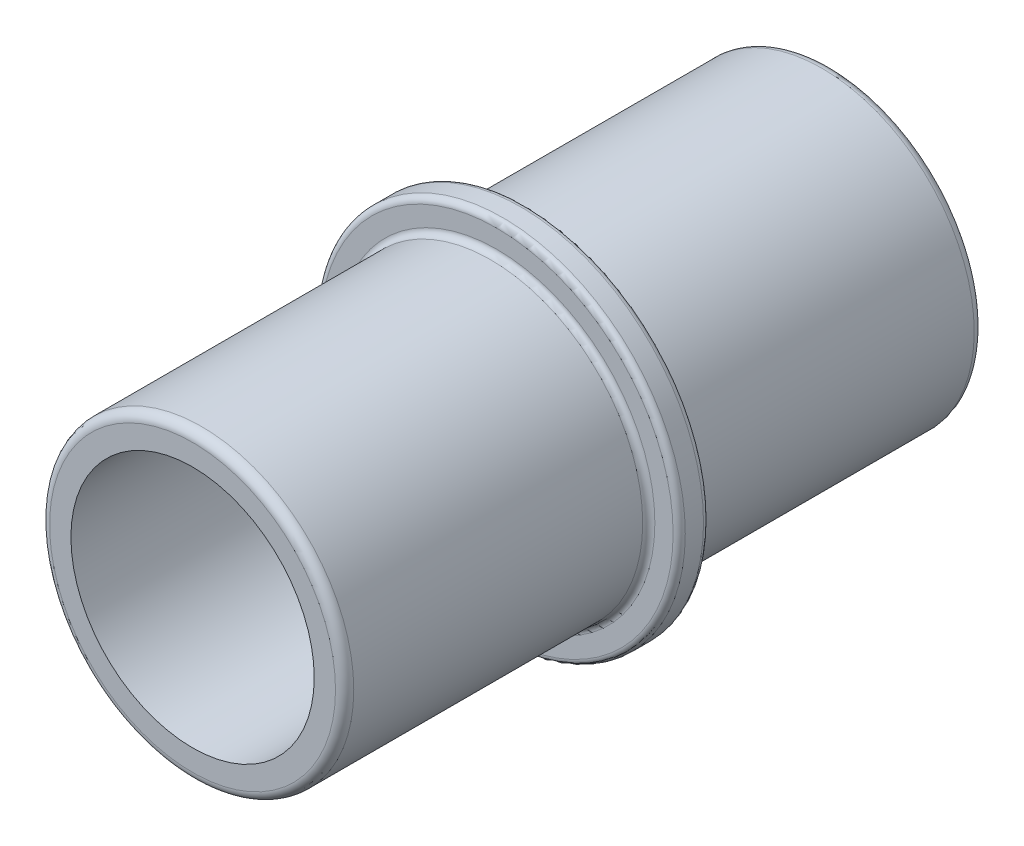
ISO-10303-21;
HEADER;
FILE_DESCRIPTION(('STEP AP214'),'2;1');
FILE_NAME('part.step','',(''),(''),'','','');
FILE_SCHEMA(('AUTOMOTIVE_DESIGN { 1 0 10303 214 1 1 1 1 }'));
ENDSEC;
DATA;
#1=APPLICATION_CONTEXT('core data for automotive mechanical design processes');
#2=APPLICATION_PROTOCOL_DEFINITION('international standard','automotive_design',2000,#1);
#3=PRODUCT_CONTEXT('',#1,'mechanical');
#4=PRODUCT('Part','Part','',(#3));
#5=PRODUCT_RELATED_PRODUCT_CATEGORY('part','',(#4));
#6=PRODUCT_DEFINITION_FORMATION('','',#4);
#7=PRODUCT_DEFINITION_CONTEXT('part definition',#1,'design');
#8=PRODUCT_DEFINITION('design','',#6,#7);
#9=PRODUCT_DEFINITION_SHAPE('','',#8);
#10=(LENGTH_UNIT() NAMED_UNIT(*) SI_UNIT(.MILLI.,.METRE.));
#11=(NAMED_UNIT(*) PLANE_ANGLE_UNIT() SI_UNIT($,.RADIAN.));
#12=(NAMED_UNIT(*) SI_UNIT($,.STERADIAN.) SOLID_ANGLE_UNIT());
#13=UNCERTAINTY_MEASURE_WITH_UNIT(LENGTH_MEASURE(1.E-05),#10,'distance_accuracy_value','');
#14=(GEOMETRIC_REPRESENTATION_CONTEXT(3) GLOBAL_UNCERTAINTY_ASSIGNED_CONTEXT((#13)) GLOBAL_UNIT_ASSIGNED_CONTEXT((#10,
#11,#12)) REPRESENTATION_CONTEXT('',''));
#15=CARTESIAN_POINT('',(0.,0.,0.));
#16=DIRECTION('',(0.,0.,1.));
#17=DIRECTION('',(1.,0.,0.));
#18=AXIS2_PLACEMENT_3D('',#15,#16,#17);
#19=CARTESIAN_POINT('',(0.,0.,-0.97));
#20=DIRECTION('',(0.,0.,-1.));
#21=DIRECTION('',(-1.,0.,0.));
#22=AXIS2_PLACEMENT_3D('',#19,#20,#21);
#23=TOROIDAL_SURFACE('',#22,0.47,0.03);
#24=CARTESIAN_POINT('',(0.,0.,-1.));
#25=DIRECTION('',(0.,0.,-1.));
#26=DIRECTION('',(-1.,0.,0.));
#27=AXIS2_PLACEMENT_3D('',#24,#25,#26);
#28=CIRCLE('',#27,0.47);
#29=CARTESIAN_POINT('',(-0.47,0.,-1.));
#30=VERTEX_POINT('',#29);
#31=EDGE_CURVE('E39',#30,#30,#28,.T.);
#32=ORIENTED_EDGE('',*,*,#31,.F.);
#33=EDGE_LOOP('',(#32));
#34=FACE_BOUND('',#33,.T.);
#35=CARTESIAN_POINT('',(0.,0.,-0.97));
#36=DIRECTION('',(0.,0.,-1.));
#37=DIRECTION('',(-1.,0.,0.));
#38=AXIS2_PLACEMENT_3D('',#35,#36,#37);
#39=CIRCLE('',#38,0.5);
#40=CARTESIAN_POINT('',(-0.5,0.,-0.97));
#41=VERTEX_POINT('',#40);
#42=EDGE_CURVE('E10',#41,#41,#39,.F.);
#43=ORIENTED_EDGE('',*,*,#42,.F.);
#44=EDGE_LOOP('',(#43));
#45=FACE_BOUND('',#44,.T.);
#46=ADVANCED_FACE('F33',(#34,#45),#23,.T.);
#47=CARTESIAN_POINT('',(0.,0.,1.07));
#48=DIRECTION('',(0.,0.,1.));
#49=DIRECTION('',(1.,0.,0.));
#50=AXIS2_PLACEMENT_3D('',#47,#48,#49);
#51=TOROIDAL_SURFACE('',#50,0.47,0.03);
#52=CARTESIAN_POINT('',(0.,0.,1.07));
#53=DIRECTION('',(0.,0.,1.));
#54=DIRECTION('',(1.,0.,0.));
#55=AXIS2_PLACEMENT_3D('',#52,#53,#54);
#56=CIRCLE('',#55,0.5);
#57=CARTESIAN_POINT('',(0.5,0.,1.07));
#58=VERTEX_POINT('',#57);
#59=EDGE_CURVE('E47',#58,#58,#56,.F.);
#60=ORIENTED_EDGE('',*,*,#59,.F.);
#61=EDGE_LOOP('',(#60));
#62=FACE_BOUND('',#61,.T.);
#63=CARTESIAN_POINT('',(0.,0.,1.1));
#64=DIRECTION('',(0.,0.,1.));
#65=DIRECTION('',(1.,0.,0.));
#66=AXIS2_PLACEMENT_3D('',#63,#64,#65);
#67=CIRCLE('',#66,0.47);
#68=CARTESIAN_POINT('',(0.47,0.,1.1));
#69=VERTEX_POINT('',#68);
#70=EDGE_CURVE('E43',#69,#69,#67,.T.);
#71=ORIENTED_EDGE('',*,*,#70,.F.);
#72=EDGE_LOOP('',(#71));
#73=FACE_BOUND('',#72,.T.);
#74=ADVANCED_FACE('F99',(#62,#73),#51,.T.);
#75=CARTESIAN_POINT('',(0.,0.,-0.0200000000000001));
#76=DIRECTION('',(0.,0.,1.));
#77=DIRECTION('',(1.,0.,0.));
#78=AXIS2_PLACEMENT_3D('',#75,#76,#77);
#79=TOROIDAL_SURFACE('',#78,0.52,0.02);
#80=CARTESIAN_POINT('',(0.,0.,-0.0200000000000001));
#81=DIRECTION('',(0.,0.,1.));
#82=DIRECTION('',(1.,0.,0.));
#83=AXIS2_PLACEMENT_3D('',#80,#81,#82);
#84=CIRCLE('',#83,0.5);
#85=CARTESIAN_POINT('',(0.5,0.,-0.0200000000000001));
#86=VERTEX_POINT('',#85);
#87=EDGE_CURVE('E55',#86,#86,#84,.F.);
#88=ORIENTED_EDGE('',*,*,#87,.F.);
#89=EDGE_LOOP('',(#88));
#90=FACE_BOUND('',#89,.T.);
#91=CARTESIAN_POINT('',(0.,0.,0.));
#92=DIRECTION('',(0.,0.,1.));
#93=DIRECTION('',(1.,0.,0.));
#94=AXIS2_PLACEMENT_3D('',#91,#92,#93);
#95=CIRCLE('',#94,0.52);
#96=CARTESIAN_POINT('',(0.52,0.,0.));
#97=VERTEX_POINT('',#96);
#98=EDGE_CURVE('E52',#97,#97,#95,.T.);
#99=ORIENTED_EDGE('',*,*,#98,.F.);
#100=EDGE_LOOP('',(#99));
#101=FACE_BOUND('',#100,.T.);
#102=ADVANCED_FACE('F101',(#90,#101),#79,.F.);
#103=CARTESIAN_POINT('',(0.,0.,0.12));
#104=DIRECTION('',(0.,0.,1.));
#105=DIRECTION('',(1.,0.,0.));
#106=AXIS2_PLACEMENT_3D('',#103,#104,#105);
#107=TOROIDAL_SURFACE('',#106,0.52,0.02);
#108=CARTESIAN_POINT('',(0.,0.,0.1));
#109=DIRECTION('',(0.,0.,1.));
#110=DIRECTION('',(1.,0.,0.));
#111=AXIS2_PLACEMENT_3D('',#108,#109,#110);
#112=CIRCLE('',#111,0.52);
#113=CARTESIAN_POINT('',(0.52,0.,0.1));
#114=VERTEX_POINT('',#113);
#115=EDGE_CURVE('E61',#114,#114,#112,.F.);
#116=ORIENTED_EDGE('',*,*,#115,.F.);
#117=EDGE_LOOP('',(#116));
#118=FACE_BOUND('',#117,.T.);
#119=CARTESIAN_POINT('',(0.,0.,0.12));
#120=DIRECTION('',(0.,0.,1.));
#121=DIRECTION('',(1.,0.,0.));
#122=AXIS2_PLACEMENT_3D('',#119,#120,#121);
#123=CIRCLE('',#122,0.5);
#124=CARTESIAN_POINT('',(0.5,0.,0.12));
#125=VERTEX_POINT('',#124);
#126=EDGE_CURVE('E58',#125,#125,#123,.T.);
#127=ORIENTED_EDGE('',*,*,#126,.F.);
#128=EDGE_LOOP('',(#127));
#129=FACE_BOUND('',#128,.T.);
#130=ADVANCED_FACE('F107',(#118,#129),#107,.F.);
#131=CARTESIAN_POINT('',(0.,0.,0.08));
#132=DIRECTION('',(0.,0.,1.));
#133=DIRECTION('',(1.,0.,0.));
#134=AXIS2_PLACEMENT_3D('',#131,#132,#133);
#135=TOROIDAL_SURFACE('',#134,0.58,0.02);
#136=CARTESIAN_POINT('',(0.,0.,0.08));
#137=DIRECTION('',(0.,0.,1.));
#138=DIRECTION('',(1.,0.,0.));
#139=AXIS2_PLACEMENT_3D('',#136,#137,#138);
#140=CIRCLE('',#139,0.6);
#141=CARTESIAN_POINT('',(0.6,0.,0.08));
#142=VERTEX_POINT('',#141);
#143=EDGE_CURVE('E67',#142,#142,#140,.F.);
#144=ORIENTED_EDGE('',*,*,#143,.F.);
#145=EDGE_LOOP('',(#144));
#146=FACE_BOUND('',#145,.T.);
#147=CARTESIAN_POINT('',(0.,0.,0.1));
#148=DIRECTION('',(0.,0.,1.));
#149=DIRECTION('',(1.,0.,0.));
#150=AXIS2_PLACEMENT_3D('',#147,#148,#149);
#151=CIRCLE('',#150,0.58);
#152=CARTESIAN_POINT('',(0.58,0.,0.1));
#153=VERTEX_POINT('',#152);
#154=EDGE_CURVE('E64',#153,#153,#151,.T.);
#155=ORIENTED_EDGE('',*,*,#154,.F.);
#156=EDGE_LOOP('',(#155));
#157=FACE_BOUND('',#156,.T.);
#158=ADVANCED_FACE('F115',(#146,#157),#135,.T.);
#159=CARTESIAN_POINT('',(0.,0.,0.02));
#160=DIRECTION('',(0.,0.,1.));
#161=DIRECTION('',(1.,0.,0.));
#162=AXIS2_PLACEMENT_3D('',#159,#160,#161);
#163=TOROIDAL_SURFACE('',#162,0.58,0.02);
#164=CARTESIAN_POINT('',(0.,0.,0.));
#165=DIRECTION('',(0.,0.,1.));
#166=DIRECTION('',(1.,0.,0.));
#167=AXIS2_PLACEMENT_3D('',#164,#165,#166);
#168=CIRCLE('',#167,0.58);
#169=CARTESIAN_POINT('',(0.58,0.,0.));
#170=VERTEX_POINT('',#169);
#171=EDGE_CURVE('E73',#170,#170,#168,.F.);
#172=ORIENTED_EDGE('',*,*,#171,.F.);
#173=EDGE_LOOP('',(#172));
#174=FACE_BOUND('',#173,.T.);
#175=CARTESIAN_POINT('',(0.,0.,0.02));
#176=DIRECTION('',(0.,0.,1.));
#177=DIRECTION('',(1.,0.,0.));
#178=AXIS2_PLACEMENT_3D('',#175,#176,#177);
#179=CIRCLE('',#178,0.6);
#180=CARTESIAN_POINT('',(0.6,0.,0.02));
#181=VERTEX_POINT('',#180);
#182=EDGE_CURVE('E70',#181,#181,#179,.T.);
#183=ORIENTED_EDGE('',*,*,#182,.F.);
#184=EDGE_LOOP('',(#183));
#185=FACE_BOUND('',#184,.T.);
#186=ADVANCED_FACE('F119',(#174,#185),#163,.T.);
#187=CARTESIAN_POINT('',(0.,0.,0.1));
#188=DIRECTION('',(0.,0.,-1.));
#189=DIRECTION('',(-1.,0.,0.));
#190=AXIS2_PLACEMENT_3D('',#187,#188,#189);
#191=CYLINDRICAL_SURFACE('',#190,0.6);
#192=ORIENTED_EDGE('',*,*,#143,.T.);
#193=EDGE_LOOP('',(#192));
#194=FACE_BOUND('',#193,.T.);
#195=ORIENTED_EDGE('',*,*,#182,.T.);
#196=EDGE_LOOP('',(#195));
#197=FACE_BOUND('',#196,.T.);
#198=ADVANCED_FACE('F123',(#194,#197),#191,.T.);
#199=CARTESIAN_POINT('',(0.,0.,0.1));
#200=DIRECTION('',(0.,0.,1.));
#201=DIRECTION('',(1.,0.,0.));
#202=AXIS2_PLACEMENT_3D('',#199,#200,#201);
#203=PLANE('',#202);
#204=ORIENTED_EDGE('',*,*,#115,.T.);
#205=EDGE_LOOP('',(#204));
#206=FACE_BOUND('',#205,.T.);
#207=ORIENTED_EDGE('',*,*,#154,.T.);
#208=EDGE_LOOP('',(#207));
#209=FACE_BOUND('',#208,.T.);
#210=ADVANCED_FACE('F127',(#206,#209),#203,.T.);
#211=CARTESIAN_POINT('',(0.,0.,0.));
#212=DIRECTION('',(0.,0.,1.));
#213=DIRECTION('',(1.,0.,0.));
#214=AXIS2_PLACEMENT_3D('',#211,#212,#213);
#215=PLANE('',#214);
#216=ORIENTED_EDGE('',*,*,#98,.T.);
#217=EDGE_LOOP('',(#216));
#218=FACE_BOUND('',#217,.T.);
#219=ORIENTED_EDGE('',*,*,#171,.T.);
#220=EDGE_LOOP('',(#219));
#221=FACE_BOUND('',#220,.T.);
#222=ADVANCED_FACE('F129',(#218,#221),#215,.F.);
#223=CARTESIAN_POINT('',(0.,0.,1.1));
#224=DIRECTION('',(0.,0.,-1.));
#225=DIRECTION('',(-1.,0.,0.));
#226=AXIS2_PLACEMENT_3D('',#223,#224,#225);
#227=CYLINDRICAL_SURFACE('',#226,0.5);
#228=ORIENTED_EDGE('',*,*,#59,.T.);
#229=EDGE_LOOP('',(#228));
#230=FACE_BOUND('',#229,.T.);
#231=ORIENTED_EDGE('',*,*,#126,.T.);
#232=EDGE_LOOP('',(#231));
#233=FACE_BOUND('',#232,.T.);
#234=ADVANCED_FACE('F95',(#230,#233),#227,.T.);
#235=CARTESIAN_POINT('',(0.,0.,1.1));
#236=DIRECTION('',(0.,0.,1.));
#237=DIRECTION('',(1.,0.,0.));
#238=AXIS2_PLACEMENT_3D('',#235,#236,#237);
#239=PLANE('',#238);
#240=CARTESIAN_POINT('',(0.,0.,1.1));
#241=DIRECTION('',(0.,0.,1.));
#242=DIRECTION('',(1.,0.,0.));
#243=AXIS2_PLACEMENT_3D('',#240,#241,#242);
#244=CIRCLE('',#243,0.4);
#245=CARTESIAN_POINT('',(0.4,0.,1.1));
#246=VERTEX_POINT('',#245);
#247=EDGE_CURVE('E77',#246,#246,#244,.T.);
#248=ORIENTED_EDGE('',*,*,#247,.F.);
#249=EDGE_LOOP('',(#248));
#250=FACE_BOUND('',#249,.T.);
#251=ORIENTED_EDGE('',*,*,#70,.T.);
#252=EDGE_LOOP('',(#251));
#253=FACE_BOUND('',#252,.T.);
#254=ADVANCED_FACE('F91',(#250,#253),#239,.T.);
#255=CARTESIAN_POINT('',(0.,0.,-1.));
#256=DIRECTION('',(0.,0.,1.));
#257=DIRECTION('',(1.,0.,0.));
#258=AXIS2_PLACEMENT_3D('',#255,#256,#257);
#259=CYLINDRICAL_SURFACE('',#258,0.5);
#260=ORIENTED_EDGE('',*,*,#42,.T.);
#261=EDGE_LOOP('',(#260));
#262=FACE_BOUND('',#261,.T.);
#263=ORIENTED_EDGE('',*,*,#87,.T.);
#264=EDGE_LOOP('',(#263));
#265=FACE_BOUND('',#264,.T.);
#266=ADVANCED_FACE('F94',(#262,#265),#259,.T.);
#267=CARTESIAN_POINT('',(0.,0.,-1.));
#268=DIRECTION('',(0.,0.,-1.));
#269=DIRECTION('',(-1.,0.,0.));
#270=AXIS2_PLACEMENT_3D('',#267,#268,#269);
#271=PLANE('',#270);
#272=CARTESIAN_POINT('',(0.,0.,-1.));
#273=DIRECTION('',(0.,0.,1.));
#274=DIRECTION('',(1.,0.,0.));
#275=AXIS2_PLACEMENT_3D('',#272,#273,#274);
#276=CIRCLE('',#275,0.4);
#277=CARTESIAN_POINT('',(0.4,0.,-1.));
#278=VERTEX_POINT('',#277);
#279=EDGE_CURVE('E76',#278,#278,#276,.T.);
#280=ORIENTED_EDGE('',*,*,#279,.T.);
#281=EDGE_LOOP('',(#280));
#282=FACE_BOUND('',#281,.T.);
#283=ORIENTED_EDGE('',*,*,#31,.T.);
#284=EDGE_LOOP('',(#283));
#285=FACE_BOUND('',#284,.T.);
#286=ADVANCED_FACE('F83',(#282,#285),#271,.T.);
#287=CARTESIAN_POINT('',(0.,0.,-1.));
#288=DIRECTION('',(0.,0.,1.));
#289=DIRECTION('',(1.,0.,0.));
#290=AXIS2_PLACEMENT_3D('',#287,#288,#289);
#291=CYLINDRICAL_SURFACE('',#290,0.4);
#292=ORIENTED_EDGE('',*,*,#279,.F.);
#293=EDGE_LOOP('',(#292));
#294=FACE_BOUND('',#293,.T.);
#295=ORIENTED_EDGE('',*,*,#247,.T.);
#296=EDGE_LOOP('',(#295));
#297=FACE_BOUND('',#296,.T.);
#298=ADVANCED_FACE('F85',(#294,#297),#291,.F.);
#299=CLOSED_SHELL('',(#46,#74,#102,#130,#158,#186,#198,#210,#222,#234,#254,#266,#286,#298));
#300=MANIFOLD_SOLID_BREP('B2',#299);
#301=ADVANCED_BREP_SHAPE_REPRESENTATION('',(#18,#300),#14);
#302=SHAPE_DEFINITION_REPRESENTATION(#9,#301);
ENDSEC;
END-ISO-10303-21;
